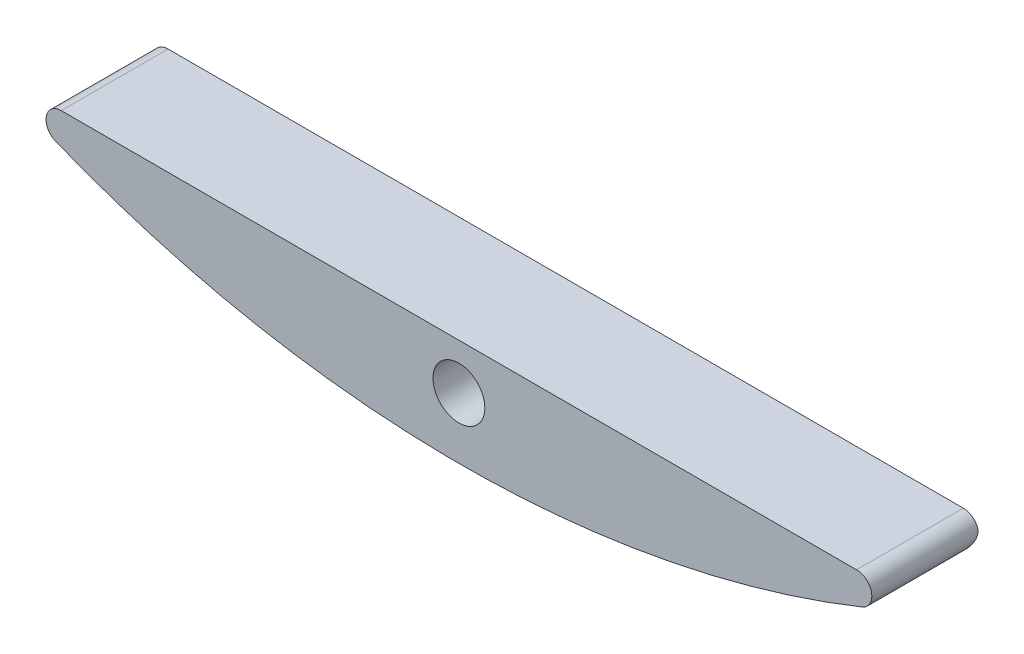
ISO-10303-21;
HEADER;
FILE_DESCRIPTION(('STEP AP214'),'2;1');
FILE_NAME('part.step','',(''),(''),'','','');
FILE_SCHEMA(('AUTOMOTIVE_DESIGN { 1 0 10303 214 1 1 1 1 }'));
ENDSEC;
DATA;
#1=APPLICATION_CONTEXT('core data for automotive mechanical design processes');
#2=APPLICATION_PROTOCOL_DEFINITION('international standard','automotive_design',2000,#1);
#3=PRODUCT_CONTEXT('',#1,'mechanical');
#4=PRODUCT('Part','Part','',(#3));
#5=PRODUCT_RELATED_PRODUCT_CATEGORY('part','',(#4));
#6=PRODUCT_DEFINITION_FORMATION('','',#4);
#7=PRODUCT_DEFINITION_CONTEXT('part definition',#1,'design');
#8=PRODUCT_DEFINITION('design','',#6,#7);
#9=PRODUCT_DEFINITION_SHAPE('','',#8);
#10=(LENGTH_UNIT() NAMED_UNIT(*) SI_UNIT(.MILLI.,.METRE.));
#11=(NAMED_UNIT(*) PLANE_ANGLE_UNIT() SI_UNIT($,.RADIAN.));
#12=(NAMED_UNIT(*) SI_UNIT($,.STERADIAN.) SOLID_ANGLE_UNIT());
#13=UNCERTAINTY_MEASURE_WITH_UNIT(LENGTH_MEASURE(1.E-05),#10,'distance_accuracy_value','');
#14=(GEOMETRIC_REPRESENTATION_CONTEXT(3) GLOBAL_UNCERTAINTY_ASSIGNED_CONTEXT((#13)) GLOBAL_UNIT_ASSIGNED_CONTEXT((#10,
#11,#12)) REPRESENTATION_CONTEXT('',''));
#15=CARTESIAN_POINT('',(0.,0.,0.));
#16=DIRECTION('',(0.,0.,1.));
#17=DIRECTION('',(1.,0.,0.));
#18=AXIS2_PLACEMENT_3D('',#15,#16,#17);
#19=CARTESIAN_POINT('',(-65.4,-39.4091480503921,2.25));
#20=CARTESIAN_POINT('',(-65.4,-47.1758168926533,2.25));
#21=CARTESIAN_POINT('',(-62.002230156418,-62.7091545771757,2.25));
#22=CARTESIAN_POINT('',(-47.4725158501259,-82.4825096861815,2.25));
#23=CARTESIAN_POINT('',(-25.7003697345645,-95.7103519433827,2.25));
#24=CARTESIAN_POINT('',(0.,-100.358546103897,2.25));
#25=CARTESIAN_POINT('',(25.7003697345645,-95.7103519433827,2.25));
#26=CARTESIAN_POINT('',(47.4725158501259,-82.4825096861814,2.25));
#27=CARTESIAN_POINT('',(62.002230156418,-62.7091545771757,2.25));
#28=CARTESIAN_POINT('',(67.098884921791,-39.4091480503921,2.25));
#29=CARTESIAN_POINT('',(62.002230156418,-16.1091415236085,2.25));
#30=CARTESIAN_POINT('',(47.4725158501259,3.66421358539728,2.25));
#31=CARTESIAN_POINT('',(25.7003697345645,16.8920558425985,2.25));
#32=CARTESIAN_POINT('',(0.,21.5402500031126,2.25));
#33=CARTESIAN_POINT('',(-25.7003697345644,16.8920558425985,2.25));
#34=CARTESIAN_POINT('',(-47.4725158501259,3.66421358539729,2.25));
#35=CARTESIAN_POINT('',(-62.002230156418,-16.1091415236084,2.25));
#36=CARTESIAN_POINT('',(-65.4,-31.6424792081308,2.25));
#37=CARTESIAN_POINT('',(-65.4,-39.4091480503921,2.25));
#38=B_SPLINE_CURVE_WITH_KNOTS('',3,(#19,#20,#21,#22,#23,#24,#25,#26,#27,#28,#29,#30,#31,#32,#33,
#34,#35,#36,#37),.UNSPECIFIED.,.T.,.F.,(4,1,1,1,1,1,1,1,1,1,1,1,1,1,1,1,4),(0.,
0.392699081698724,0.785398163397448,1.17809724509617,1.5707963267949,1.96349540849362,
2.35619449019234,2.74889357189107,3.14159265358979,3.53429173528852,3.92699081698724,
4.31968989868597,4.71238898038469,5.10508806208341,5.49778714378214,5.89048622548086,
6.28318530717959),.UNSPECIFIED.);
#39=DIRECTION('',(0.,0.,-1.));
#40=VECTOR('',#39,1.);
#41=SURFACE_OF_LINEAR_EXTRUSION('',#38,#40);
#42=CARTESIAN_POINT('',(30.794718129518,-91.8091480503918,-2.25));
#43=CARTESIAN_POINT('',(30.2011780925464,-92.0972566747419,-2.25));
#44=CARTESIAN_POINT('',(29.6034440823991,-92.3767206262725,-2.25));
#45=CARTESIAN_POINT('',(28.4001190225392,-92.9181741411607,-2.25));
#46=CARTESIAN_POINT('',(27.7945280388364,-93.1801638512135,-2.25));
#47=CARTESIAN_POINT('',(26.5762465787074,-93.6863903612771,-2.25));
#48=CARTESIAN_POINT('',(25.9635589509341,-93.9306340166567,-2.25));
#49=CARTESIAN_POINT('',(24.731367770029,-94.4012710823301,-2.25));
#50=CARTESIAN_POINT('',(24.1118642141463,-94.6276644854194,-2.25));
#51=CARTESIAN_POINT('',(22.8666725995772,-95.0625724447579,-2.25));
#52=CARTESIAN_POINT('',(22.2409851058195,-95.2710886176346,-2.25));
#53=CARTESIAN_POINT('',(20.9839649732248,-95.6702787336811,-2.25));
#54=CARTESIAN_POINT('',(20.3526323245649,-95.8609526457977,-2.25));
#55=CARTESIAN_POINT('',(18.4514323909557,-96.4060908893161,-2.25));
#56=CARTESIAN_POINT('',(17.1738017252775,-96.7338674402645,-2.25));
#57=CARTESIAN_POINT('',(14.6023120740567,-97.3180993229161,-2.25));
#58=CARTESIAN_POINT('',(13.3084516127075,-97.5745481187898,-2.25));
#59=CARTESIAN_POINT('',(10.7085426686302,-98.0158984217001,-2.25));
#60=CARTESIAN_POINT('',(9.40249394642821,-98.2007985199102,-2.25));
#61=CARTESIAN_POINT('',(6.78295838696138,-98.4985402968712,-2.25));
#62=CARTESIAN_POINT('',(5.46947614172936,-98.6114224084434,-2.25));
#63=CARTESIAN_POINT('',(2.83833320768969,-98.7647046431156,-2.25));
#64=CARTESIAN_POINT('',(1.52067270701526,-98.8051079845474,-2.25));
#65=CARTESIAN_POINT('',(-1.11491072442326,-98.8126089118688,-2.25));
#66=CARTESIAN_POINT('',(-2.43283366355025,-98.7797035776013,-2.25));
#67=CARTESIAN_POINT('',(-5.06371075228979,-98.6413787228765,-2.25));
#68=CARTESIAN_POINT('',(-6.37666821196563,-98.5360219022534,-2.25));
#69=CARTESIAN_POINT('',(-8.99481861325401,-98.2534944872503,-2.25));
#70=CARTESIAN_POINT('',(-10.3000116809926,-98.0763250626556,-2.25));
#71=CARTESIAN_POINT('',(-12.8984296712964,-97.6506456759797,-2.25));
#72=CARTESIAN_POINT('',(-14.1916568638577,-97.4021495437976,-2.25));
#73=CARTESIAN_POINT('',(-16.7998015054205,-96.8257665203377,-2.25));
#74=CARTESIAN_POINT('',(-18.1142596733684,-96.4957854363028,-2.25));
#75=CARTESIAN_POINT('',(-20.0697059225313,-95.9444845701751,-2.25));
#76=CARTESIAN_POINT('',(-20.7187623451428,-95.7513474170514,-2.25));
#77=CARTESIAN_POINT('',(-22.011000938753,-95.3462617114354,-2.25));
#78=CARTESIAN_POINT('',(-22.6541831242552,-95.1343132054023,-2.25));
#79=CARTESIAN_POINT('',(-23.9336452406336,-94.6917290591618,-2.25));
#80=CARTESIAN_POINT('',(-24.5699291212325,-94.4611048309583,-2.25));
#81=CARTESIAN_POINT('',(-25.8353653438626,-93.9810515411192,-2.25));
#82=CARTESIAN_POINT('',(-26.4645176905504,-93.7316224917636,-2.25));
#83=CARTESIAN_POINT('',(-27.7153783850951,-93.2140773527534,-2.25));
#84=CARTESIAN_POINT('',(-28.337083708085,-92.9459539524835,-2.25));
#85=CARTESIAN_POINT('',(-29.5722372385059,-92.3913035350787,-2.25));
#86=CARTESIAN_POINT('',(-30.1856853638164,-92.1047763350753,-2.25));
#87=CARTESIAN_POINT('',(-30.794718129518,-91.8091480503918,-2.25));
#88=B_SPLINE_CURVE_WITH_KNOTS('',3,(#42,#43,#44,#45,#46,#47,#48,#49,#50,#51,#52,#53,#54,#55,#56,
#57,#58,#59,#60,#61,#62,#63,#64,#65,#66,#67,#68,#69,#70,#71,#72,#73,#74,#75,#76,#77,#78,#79,#80,
#81,#82,#83,#84,#85,#86,#87),.UNSPECIFIED.,.F.,.F.,(4,2,2,2,2,2,2,2,2,2,2,2,2,2,2,2,2,2,2,2,2,2,
4),(0.,1.97923679842005,3.95845697917213,5.93690846905304,7.91536075747075,9.89363394650467,
11.8719105785249,15.8266828001588,19.7818172820107,23.7370296383019,27.6900194741143,
31.6428337778752,35.5958055397465,39.5453606804563,43.4948514878124,47.4435770249539,
51.5068670162509,53.53818141951,55.5694908060673,57.5995681720336,59.6296442123323,
61.6605186359909,63.6914132424508),.UNSPECIFIED.);
#89=CARTESIAN_POINT('',(26.442037599285,-93.7370459000639,-2.25));
#90=VERTEX_POINT('',#89);
#91=CARTESIAN_POINT('',(-26.4420375992841,-93.7370459000642,-2.25));
#92=VERTEX_POINT('',#91);
#93=EDGE_CURVE('E115',#90,#92,#88,.T.);
#94=ORIENTED_EDGE('',*,*,#93,.T.);
#95=DIRECTION('',(0.,0.,-1.));
#96=VECTOR('',#95,1.);
#97=CARTESIAN_POINT('',(-26.4420375992849,-93.7370459000639,-2.25));
#98=LINE('',#97,#96);
#99=CARTESIAN_POINT('',(-26.4420375992849,-93.7370459000639,-8.25));
#100=VERTEX_POINT('',#99);
#101=EDGE_CURVE('E93',#92,#100,#98,.T.);
#102=ORIENTED_EDGE('',*,*,#101,.T.);
#103=CARTESIAN_POINT('',(49.5934281930455,-78.12852498016,-8.25));
#104=CARTESIAN_POINT('',(49.5934281930455,-78.12852498016,-9.25));
#105=CARTESIAN_POINT('',(48.8667916776592,-77.4415028738874,-9.25));
#106=CARTESIAN_POINT('',(48.9621920352396,-78.7962369749329,-8.25));
#107=CARTESIAN_POINT('',(48.9621920352396,-78.7962369749329,-9.25));
#108=CARTESIAN_POINT('',(48.2457996169623,-78.0983705772055,-9.25));
#109=CARTESIAN_POINT('',(48.3158762661979,-79.4497212453159,-8.25));
#110=CARTESIAN_POINT('',(48.3158762661979,-79.4497212453159,-9.25));
#111=CARTESIAN_POINT('',(47.6100097427402,-78.7412167905527,-9.25));
#112=CARTESIAN_POINT('',(46.9948587209965,-80.7270702001155,-8.25));
#113=CARTESIAN_POINT('',(46.9948587209965,-80.7270702001155,-9.25));
#114=CARTESIAN_POINT('',(46.3104361232715,-79.9978347061235,-9.25));
#115=CARTESIAN_POINT('',(46.3201597380186,-81.350937786298,-8.25));
#116=CARTESIAN_POINT('',(46.3201597380186,-81.350937786298,-9.25));
#117=CARTESIAN_POINT('',(45.6466551326049,-80.6116092566997,-9.25));
#118=CARTESIAN_POINT('',(44.9443798175133,-82.5677064053719,-8.25));
#119=CARTESIAN_POINT('',(44.9443798175133,-82.5677064053719,-9.25));
#120=CARTESIAN_POINT('',(44.2929282541328,-81.8088723439637,-9.25));
#121=CARTESIAN_POINT('',(44.243312689071,-83.1606232692094,-8.25));
#122=CARTESIAN_POINT('',(44.243312689071,-83.1606232692094,-9.25));
#123=CARTESIAN_POINT('',(43.6029960603659,-82.3923763627219,-9.25));
#124=CARTESIAN_POINT('',(42.8164477685032,-84.3153808171791,-8.25));
#125=CARTESIAN_POINT('',(42.8164477685033,-84.3153808171791,-9.25));
#126=CARTESIAN_POINT('',(42.1985729604546,-83.528972035592,-9.25));
#127=CARTESIAN_POINT('',(42.0906493455727,-84.8772207076909,-8.25));
#128=CARTESIAN_POINT('',(42.0906493455727,-84.8772207076909,-9.25));
#129=CARTESIAN_POINT('',(41.484081427887,-84.0820629130338,-9.25));
#130=CARTESIAN_POINT('',(39.8798486542364,-86.5146337481324,-8.25));
#131=CARTESIAN_POINT('',(39.8798486542364,-86.5146337481324,-9.25));
#132=CARTESIAN_POINT('',(39.3074377897811,-85.6941770584981,-9.25));
#133=CARTESIAN_POINT('',(38.3601414254111,-87.5432453369878,-8.25));
#134=CARTESIAN_POINT('',(38.3601414254111,-87.5432453369878,-9.25));
#135=CARTESIAN_POINT('',(37.8108378850225,-86.7071687042801,-9.25));
#136=CARTESIAN_POINT('',(35.2415743535403,-89.4713572476564,-8.25));
#137=CARTESIAN_POINT('',(35.2415743535403,-89.4713572476564,-9.25));
#138=CARTESIAN_POINT('',(34.7391305296439,-88.6063085229095,-9.25));
#139=CARTESIAN_POINT('',(33.6427056132717,-90.3708430120878,-8.25));
#140=CARTESIAN_POINT('',(33.6427056132717,-90.3708430120878,-9.25));
#141=CARTESIAN_POINT('',(33.1640142541743,-89.4924423940391,-9.25));
#142=CARTESIAN_POINT('',(31.1957428053073,-91.6197376306132,-8.25));
#143=CARTESIAN_POINT('',(31.1957428053072,-91.6197376306131,-9.25));
#144=CARTESIAN_POINT('',(30.7531708098857,-90.7229034016597,-9.25));
#145=CARTESIAN_POINT('',(30.3726250516259,-92.0190470200993,-8.25));
#146=CARTESIAN_POINT('',(30.3726250516259,-92.0190470200993,-9.25));
#147=CARTESIAN_POINT('',(29.9421651948396,-91.1163378347765,-9.25));
#148=CARTESIAN_POINT('',(28.7109949917896,-92.7841946511349,-8.25));
#149=CARTESIAN_POINT('',(28.7109949917896,-92.7841946511349,-9.25));
#150=CARTESIAN_POINT('',(28.3049268299432,-91.8702528314385,-9.25));
#151=CARTESIAN_POINT('',(27.872482743161,-93.1500330177287,-8.25));
#152=CARTESIAN_POINT('',(27.872482743161,-93.1500330177287,-9.25));
#153=CARTESIAN_POINT('',(27.4786941369935,-92.2307335180958,-9.25));
#154=CARTESIAN_POINT('',(26.1813722584244,-93.8477429576111,-8.25));
#155=CARTESIAN_POINT('',(26.1813722584244,-93.8477429576111,-9.25));
#156=CARTESIAN_POINT('',(25.8123668582336,-92.9182197768113,-9.25));
#157=CARTESIAN_POINT('',(25.3287730863244,-94.1796122632314,-8.25));
#158=CARTESIAN_POINT('',(25.3287730863244,-94.1796122632313,-9.25));
#159=CARTESIAN_POINT('',(24.9722713513268,-93.2452231140267,-9.25));
#160=CARTESIAN_POINT('',(23.6111519939455,-94.80888715313,-8.25));
#161=CARTESIAN_POINT('',(23.6111519939455,-94.80888715313,-9.25));
#162=CARTESIAN_POINT('',(23.2796730224148,-93.8653299379689,-9.25));
#163=CARTESIAN_POINT('',(22.7461301378323,-95.1062929153474,-8.25));
#164=CARTESIAN_POINT('',(22.7461301378323,-95.1062929153474,-9.25));
#165=CARTESIAN_POINT('',(22.4271702644952,-94.1584335997234,-9.25));
#166=CARTESIAN_POINT('',(21.0069526683353,-95.6661983320282,-8.25));
#167=CARTESIAN_POINT('',(21.0069526683353,-95.6661983320282,-9.25));
#168=CARTESIAN_POINT('',(20.7129837404664,-94.7102934066247,-9.25));
#169=CARTESIAN_POINT('',(20.1328187230868,-95.9287664498203,-8.25));
#170=CARTESIAN_POINT('',(20.1328187230868,-95.9287664498203,-9.25));
#171=CARTESIAN_POINT('',(19.8513216869309,-94.9691169176836,-9.25));
#172=CARTESIAN_POINT('',(18.3752051350902,-96.4197137557571,-8.25));
#173=CARTESIAN_POINT('',(18.3752051350902,-96.4197137557571,-9.25));
#174=CARTESIAN_POINT('',(18.1186514905431,-95.4530970900416,-9.25));
#175=CARTESIAN_POINT('',(17.4917252193489,-96.648091942255,-8.25));
#176=CARTESIAN_POINT('',(17.4917252193489,-96.648091942255,-9.25));
#177=CARTESIAN_POINT('',(17.2476430746755,-95.6782527649893,-9.25));
#178=CARTESIAN_POINT('',(14.830018947878,-97.2817750670188,-8.25));
#179=CARTESIAN_POINT('',(14.830018947878,-97.2817750670188,-9.25));
#180=CARTESIAN_POINT('',(14.6233560212484,-96.3030265955828,-9.25));
#181=CARTESIAN_POINT('',(13.0393483992415,-97.6360064991428,-8.25));
#182=CARTESIAN_POINT('',(13.0393483992415,-97.6360064991428,-9.25));
#183=CARTESIAN_POINT('',(12.8576547422262,-96.6523241092479,-9.25));
#184=CARTESIAN_POINT('',(10.715859440594,-98.0045340790212,-8.25));
#185=CARTESIAN_POINT('',(10.715859440594,-98.0045340790212,-9.25));
#186=CARTESIAN_POINT('',(10.5664787858845,-97.0157270208898,-9.25));
#187=CARTESIAN_POINT('',(10.1922684785192,-98.0816637399502,-8.25));
#188=CARTESIAN_POINT('',(10.1922684785192,-98.0816637399502,-9.25));
#189=CARTESIAN_POINT('',(10.0501638767021,-97.0917848110452,-9.25));
#190=CARTESIAN_POINT('',(9.1434643021272,-98.2243657308272,-8.25));
#191=CARTESIAN_POINT('',(9.1434643021272,-98.2243657308271,-9.25));
#192=CARTESIAN_POINT('',(9.01593003769267,-97.2325042928294,-9.25));
#193=CARTESIAN_POINT('',(8.61825098915001,-98.2899373432326,-8.25));
#194=CARTESIAN_POINT('',(8.61825098915001,-98.2899373432326,-9.25));
#195=CARTESIAN_POINT('',(8.49801101030903,-97.2971652769259,-9.25));
#196=CARTESIAN_POINT('',(6.93299877533559,-98.4814860407133,-8.25));
#197=CARTESIAN_POINT('',(6.93299877533559,-98.4814860407133,-9.25));
#198=CARTESIAN_POINT('',(6.83616695168673,-97.486053314074,-9.25));
#199=CARTESIAN_POINT('',(5.77033656411985,-98.5850836330322,-8.25));
#200=CARTESIAN_POINT('',(5.77033656411986,-98.5850836330322,-9.25));
#201=CARTESIAN_POINT('',(5.68965862971359,-97.5882110436265,-9.25));
#202=CARTESIAN_POINT('',(3.44109089465123,-98.7355424983645,-8.25));
#203=CARTESIAN_POINT('',(3.44109089465123,-98.7355424983645,-9.25));
#204=CARTESIAN_POINT('',(3.39286364237394,-97.7365735477155,-9.25));
#205=CARTESIAN_POINT('',(2.27450676698801,-98.7823935351213,-8.25));
#206=CARTESIAN_POINT('',(2.27450676698801,-98.7823935351213,-9.25));
#207=CARTESIAN_POINT('',(2.24257633284553,-97.7827682273287,-9.25));
#208=CARTESIAN_POINT('',(-0.0607148019794941,-98.8186755609444,-8.25));
#209=CARTESIAN_POINT('',(-0.0607148019794941,-98.8186755609444,-9.25));
#210=CARTESIAN_POINT('',(-0.0598929538702804,-97.8185428203457,-9.25));
#211=CARTESIAN_POINT('',(-1.22935314648314,-98.808056924214,-8.25));
#212=CARTESIAN_POINT('',(-1.22935314648314,-98.808056924214,-9.25));
#213=CARTESIAN_POINT('',(-1.21207570939803,-97.8080738039242,-9.25));
#214=CARTESIAN_POINT('',(-3.56444228036679,-98.7295371058228,-8.25));
#215=CARTESIAN_POINT('',(-3.56444228036679,-98.7295371058229,-9.25));
#216=CARTESIAN_POINT('',(-3.5144700708827,-97.7306511746737,-9.25));
#217=CARTESIAN_POINT('',(-4.73089315995236,-98.6616383407335,-8.25));
#218=CARTESIAN_POINT('',(-4.73089315995236,-98.6616383407335,-9.25));
#219=CARTESIAN_POINT('',(-4.66468175794507,-97.6636999447531,-9.25));
#220=CARTESIAN_POINT('',(-7.06296830357641,-98.4688099016889,-8.25));
#221=CARTESIAN_POINT('',(-7.06296830357641,-98.4688099016889,-9.25));
#222=CARTESIAN_POINT('',(-6.96433023770114,-97.4735537141176,-9.25));
#223=CARTESIAN_POINT('',(-8.22857698863424,-98.3436917819019,-8.25));
#224=CARTESIAN_POINT('',(-8.22857698863424,-98.3436917819019,-9.25));
#225=CARTESIAN_POINT('',(-8.11375180170509,-97.3501728683776,-9.25));
#226=CARTESIAN_POINT('',(-10.5521770272087,-98.0367500767265,-8.25));
#227=CARTESIAN_POINT('',(-10.5521770272087,-98.0367500767265,-9.25));
#228=CARTESIAN_POINT('',(-10.4050728860131,-97.0474949166142,-9.25));
#229=CARTESIAN_POINT('',(-11.7101682018595,-97.8549251646315,-8.25));
#230=CARTESIAN_POINT('',(-11.7101682018595,-97.8549251646315,-9.25));
#231=CARTESIAN_POINT('',(-11.5469722296896,-96.8681965023489,-9.25));
#232=CARTESIAN_POINT('',(-15.1682255717635,-97.224779385209,-8.25));
#233=CARTESIAN_POINT('',(-15.1682255717635,-97.224779385209,-9.25));
#234=CARTESIAN_POINT('',(-14.9568348037486,-96.2468320013781,-9.25));
#235=CARTESIAN_POINT('',(-17.4539305638631,-96.6916589365541,-8.25));
#236=CARTESIAN_POINT('',(-17.4539305638631,-96.6916589365541,-9.25));
#237=CARTESIAN_POINT('',(-17.2104961062612,-95.7211698708692,-9.25));
#238=CARTESIAN_POINT('',(-20.6772463821598,-95.7680667982215,-8.25));
#239=CARTESIAN_POINT('',(-20.6772463821598,-95.7680667982215,-9.25));
#240=CARTESIAN_POINT('',(-20.3879944165423,-94.8107061847826,-9.25));
#241=CARTESIAN_POINT('',(-21.641713787857,-95.4691007704374,-8.25));
#242=CARTESIAN_POINT('',(-21.641713787857,-95.4691007704374,-9.25));
#243=CARTESIAN_POINT('',(-21.3386696576474,-94.5160120562991,-9.25));
#244=CARTESIAN_POINT('',(-23.5570184968587,-94.8292096447175,-8.25));
#245=CARTESIAN_POINT('',(-23.5570184968587,-94.8292096447175,-9.25));
#246=CARTESIAN_POINT('',(-23.2263255284217,-93.8853594326098,-9.25));
#247=CARTESIAN_POINT('',(-24.507856331122,-94.4882861862787,-8.25));
#248=CARTESIAN_POINT('',(-24.507856331122,-94.4882861862788,-9.25));
#249=CARTESIAN_POINT('',(-24.1633066915907,-93.5494025497573,-9.25));
#250=CARTESIAN_POINT('',(-26.393373844607,-93.7646285270523,-8.25));
#251=CARTESIAN_POINT('',(-26.393373844607,-93.7646285270524,-9.25));
#252=CARTESIAN_POINT('',(-26.0212732778114,-92.8363184185438,-9.25));
#253=CARTESIAN_POINT('',(-27.3280564593725,-93.3819020167514,-8.25));
#254=CARTESIAN_POINT('',(-27.3280564593725,-93.3819020167514,-9.25));
#255=CARTESIAN_POINT('',(-26.942261607045,-92.4591987428899,-9.25));
#256=CARTESIAN_POINT('',(-29.1794777551707,-92.5753903035714,-8.25));
#257=CARTESIAN_POINT('',(-29.1794777551707,-92.5753903035714,-9.25));
#258=CARTESIAN_POINT('',(-28.7665344882545,-91.6645130864599,-9.25));
#259=CARTESIAN_POINT('',(-30.0962160406537,-92.1516041968314,-8.25));
#260=CARTESIAN_POINT('',(-30.0962160406537,-92.1516041968314,-9.25));
#261=CARTESIAN_POINT('',(-29.669818649975,-91.2469462153039,-9.25));
#262=CARTESIAN_POINT('',(-32.8131558298346,-90.8212837789731,-8.25));
#263=CARTESIAN_POINT('',(-32.8131558298346,-90.8212837789731,-9.25));
#264=CARTESIAN_POINT('',(-32.3467602381234,-89.9362098740444,-9.25));
#265=CARTESIAN_POINT('',(-34.5845001766106,-89.8540923703706,-8.25));
#266=CARTESIAN_POINT('',(-34.5845001766106,-89.8540923703706,-9.25));
#267=CARTESIAN_POINT('',(-34.0918604203666,-88.9833342658081,-9.25));
#268=CARTESIAN_POINT('',(-37.1706897484566,-88.2859900761555,-8.25));
#269=CARTESIAN_POINT('',(-37.1706897484566,-88.2859900761555,-9.25));
#270=CARTESIAN_POINT('',(-36.639280348356,-87.4387401214059,-9.25));
#271=CARTESIAN_POINT('',(-38.0212740438454,-87.7434966147668,-8.25));
#272=CARTESIAN_POINT('',(-38.0212740438454,-87.7434966147668,-9.25));
#273=CARTESIAN_POINT('',(-37.4770358578565,-86.9044254588209,-9.25));
#274=CARTESIAN_POINT('',(-39.6968545167024,-86.6198087550523,-8.25));
#275=CARTESIAN_POINT('',(-39.6968545167024,-86.6198087550523,-9.25));
#276=CARTESIAN_POINT('',(-39.1271561314327,-85.7978123882546,-9.25));
#277=CARTESIAN_POINT('',(-40.5218488039839,-86.038611507831,-8.25));
#278=CARTESIAN_POINT('',(-40.5218488039839,-86.0386115078311,-9.25));
#279=CARTESIAN_POINT('',(-39.9395190199354,-85.2255111841828,-9.25));
#280=CARTESIAN_POINT('',(-41.333129610401,-85.4382659631629,-8.25));
#281=CARTESIAN_POINT('',(-41.333129610401,-85.4382659631629,-9.25));
#282=CARTESIAN_POINT('',(-40.7382654342061,-84.6344397307718,-9.25));
#283=(BOUNDED_SURFACE() B_SPLINE_SURFACE(3,2,((#103,#104,#105),(#106,#107,#108),(#109,#110,
#111),(#112,#113,#114),(#115,#116,#117),(#118,#119,#120),(#121,#122,#123),(#124,#125,#126),
(#127,#128,#129),(#130,#131,#132),(#133,#134,#135),(#136,#137,#138),(#139,#140,#141),(#142,#143,
#144),(#145,#146,#147),(#148,#149,#150),(#151,#152,#153),(#154,#155,#156),(#157,#158,#159),
(#160,#161,#162),(#163,#164,#165),(#166,#167,#168),(#169,#170,#171),(#172,#173,#174),(#175,#176,
#177),(#178,#179,#180),(#181,#182,#183),(#184,#185,#186),(#187,#188,#189),(#190,#191,#192),
(#193,#194,#195),(#196,#197,#198),(#199,#200,#201),(#202,#203,#204),(#205,#206,#207),(#208,#209,
#210),(#211,#212,#213),(#214,#215,#216),(#217,#218,#219),(#220,#221,#222),(#223,#224,#225),
(#226,#227,#228),(#229,#230,#231),(#232,#233,#234),(#235,#236,#237),(#238,#239,#240),(#241,#242,
#243),(#244,#245,#246),(#247,#248,#249),(#250,#251,#252),(#253,#254,#255),(#256,#257,#258),
(#259,#260,#261),(#262,#263,#264),(#265,#266,#267),(#268,#269,#270),(#271,#272,#273),(#274,#275,
#276),(#277,#278,#279),(#280,#281,#282)),.UNSPECIFIED.,.F.,.F.,
.F.) B_SPLINE_SURFACE_WITH_KNOTS((4,2,2,2,2,2,2,2,2,2,2,2,2,2,2,2,2,2,2,2,2,2,2,2,2,2,2,2,2,4),
(3,3),(0.,2.71155253751283,5.42283885351271,8.13272450831321,10.8426793342256,16.2574926823426,
21.6729160068637,24.3765056424236,27.0800851772331,29.783845077006,32.4875910163511,
35.1859422347496,37.884372490048,43.2775845645025,44.8431888637541,46.4088903240608,
49.8605636326947,53.3128594805109,56.76813690524,60.2232685637617,63.6898621985124,
67.1565369434347,74.0852884801368,77.0705473810624,80.0556896692685,83.0402837043869,
86.0249434554793,91.9803203451456,94.9603905123252,97.940680278506),(0.,1.),
.UNSPECIFIED.) GEOMETRIC_REPRESENTATION_ITEM() RATIONAL_B_SPLINE_SURFACE(((1.,0.707106781186548,
1.),(1.,0.707106781186548,1.),(1.,0.707106781186548,1.),(1.,0.707106781186548,1.),(1.,
0.707106781186548,1.),(1.,0.707106781186548,1.),(1.,0.707106781186548,1.),(1.,0.707106781186548,
1.),(1.,0.707106781186548,1.),(1.,0.707106781186548,1.),(1.,0.707106781186548,1.),(1.,
0.707106781186548,1.),(1.,0.707106781186548,1.),(1.,0.707106781186548,1.),(1.,0.707106781186548,
1.),(1.,0.707106781186548,1.),(1.,0.707106781186548,1.),(1.,0.707106781186548,1.),(1.,
0.707106781186548,1.),(1.,0.707106781186548,1.),(1.,0.707106781186548,1.),(1.,0.707106781186548,
1.),(1.,0.707106781186548,1.),(1.,0.707106781186548,1.),(1.,0.707106781186548,1.),(1.,
0.707106781186548,1.),(1.,0.707106781186548,1.),(1.,0.707106781186548,1.),(1.,0.707106781186548,
1.),(1.,0.707106781186548,1.),(1.,0.707106781186548,1.),(1.,0.707106781186548,1.),(1.,
0.707106781186548,1.),(1.,0.707106781186548,1.),(1.,0.707106781186548,1.),(1.,0.707106781186548,
1.),(1.,0.707106781186548,1.),(1.,0.707106781186548,1.),(1.,0.707106781186548,1.),(1.,
0.707106781186548,1.),(1.,0.707106781186548,1.),(1.,0.707106781186548,1.),(1.,0.707106781186548,
1.),(1.,0.707106781186548,1.),(1.,0.707106781186548,1.),(1.,0.707106781186548,1.),(1.,
0.707106781186548,1.),(1.,0.707106781186548,1.),(1.,0.707106781186548,1.),(1.,0.707106781186548,
1.),(1.,0.707106781186548,1.),(1.,0.707106781186548,1.),(1.,0.707106781186548,1.),(1.,
0.707106781186548,1.),(1.,0.707106781186548,1.),(1.,0.707106781186548,1.),(1.,0.707106781186548,
1.),(1.,0.707106781186548,1.),(1.,0.707106781186548,1.),(1.,0.707106781186548,1.))) REPRESENTATION_ITEM('') SURFACE());
#284=CARTESIAN_POINT('',(-41.333129610401,-85.4382659631629,-8.25));
#285=CARTESIAN_POINT('',(-40.5218488039839,-86.038611507831,-8.25));
#286=CARTESIAN_POINT('',(-39.6968545167024,-86.6198087550523,-8.25));
#287=CARTESIAN_POINT('',(-38.0212740438454,-87.7434966147668,-8.25));
#288=CARTESIAN_POINT('',(-37.1706897484566,-88.2859900761555,-8.25));
#289=CARTESIAN_POINT('',(-34.5845001766106,-89.8540923703706,-8.25));
#290=CARTESIAN_POINT('',(-32.8131558298346,-90.8212837789731,-8.25));
#291=CARTESIAN_POINT('',(-30.0962160406537,-92.1516041968314,-8.25));
#292=CARTESIAN_POINT('',(-29.1794777551707,-92.5753903035714,-8.25));
#293=CARTESIAN_POINT('',(-27.3280564593725,-93.3819020167514,-8.25));
#294=CARTESIAN_POINT('',(-26.393373844607,-93.7646285270523,-8.25));
#295=CARTESIAN_POINT('',(-24.507856331122,-94.4882861862787,-8.25));
#296=CARTESIAN_POINT('',(-23.5570184968587,-94.8292096447175,-8.25));
#297=CARTESIAN_POINT('',(-21.641713787857,-95.4691007704374,-8.25));
#298=CARTESIAN_POINT('',(-20.6772463821598,-95.7680667982215,-8.25));
#299=CARTESIAN_POINT('',(-17.4539305638631,-96.6916589365541,-8.25));
#300=CARTESIAN_POINT('',(-15.1682255717635,-97.224779385209,-8.25));
#301=CARTESIAN_POINT('',(-11.7101682018595,-97.8549251646315,-8.25));
#302=CARTESIAN_POINT('',(-10.5521770272087,-98.0367500767265,-8.25));
#303=CARTESIAN_POINT('',(-8.22857698863424,-98.3436917819019,-8.25));
#304=CARTESIAN_POINT('',(-7.06296830357641,-98.4688099016889,-8.25));
#305=CARTESIAN_POINT('',(-4.73089315995236,-98.6616383407335,-8.25));
#306=CARTESIAN_POINT('',(-3.56444228036679,-98.7295371058228,-8.25));
#307=CARTESIAN_POINT('',(-1.22935314648314,-98.808056924214,-8.25));
#308=CARTESIAN_POINT('',(-0.0607148019794951,-98.8186755609444,-8.25));
#309=CARTESIAN_POINT('',(2.27450676698801,-98.7823935351213,-8.25));
#310=CARTESIAN_POINT('',(3.44109089465123,-98.7355424983645,-8.25));
#311=CARTESIAN_POINT('',(5.77033656411985,-98.5850836330322,-8.25));
#312=CARTESIAN_POINT('',(6.93299877533559,-98.4814860407133,-8.25));
#313=CARTESIAN_POINT('',(8.61825098915001,-98.2899373432326,-8.25));
#314=CARTESIAN_POINT('',(9.1434643021272,-98.2243657308272,-8.25));
#315=CARTESIAN_POINT('',(10.1922684785192,-98.0816637399502,-8.25));
#316=CARTESIAN_POINT('',(10.715859440594,-98.0045340790212,-8.25));
#317=CARTESIAN_POINT('',(13.0393483992415,-97.6360064991428,-8.25));
#318=CARTESIAN_POINT('',(14.830018947878,-97.2817750670188,-8.25));
#319=CARTESIAN_POINT('',(17.4917252193489,-96.648091942255,-8.25));
#320=CARTESIAN_POINT('',(18.3752051350902,-96.4197137557571,-8.25));
#321=CARTESIAN_POINT('',(20.1328187230868,-95.9287664498203,-8.25));
#322=CARTESIAN_POINT('',(21.0069526683353,-95.6661983320282,-8.25));
#323=CARTESIAN_POINT('',(22.7461301378323,-95.1062929153474,-8.25));
#324=CARTESIAN_POINT('',(23.6111519939455,-94.80888715313,-8.25));
#325=CARTESIAN_POINT('',(25.3287730863244,-94.1796122632314,-8.25));
#326=CARTESIAN_POINT('',(26.1813722584244,-93.8477429576111,-8.25));
#327=CARTESIAN_POINT('',(27.872482743161,-93.1500330177287,-8.25));
#328=CARTESIAN_POINT('',(28.7109949917896,-92.7841946511349,-8.25));
#329=CARTESIAN_POINT('',(30.3726250516259,-92.0190470200993,-8.25));
#330=CARTESIAN_POINT('',(31.1957428053073,-91.6197376306131,-8.25));
#331=CARTESIAN_POINT('',(33.6427056132717,-90.3708430120878,-8.25));
#332=CARTESIAN_POINT('',(35.2415743535403,-89.4713572476564,-8.25));
#333=CARTESIAN_POINT('',(38.3601414254111,-87.5432453369878,-8.25));
#334=CARTESIAN_POINT('',(39.8798486542364,-86.5146337481324,-8.25));
#335=CARTESIAN_POINT('',(42.0906493455727,-84.8772207076909,-8.25));
#336=CARTESIAN_POINT('',(42.8164477685032,-84.3153808171791,-8.25));
#337=CARTESIAN_POINT('',(44.243312689071,-83.1606232692094,-8.25));
#338=CARTESIAN_POINT('',(44.9443798175133,-82.5677064053719,-8.25));
#339=CARTESIAN_POINT('',(46.3201597380186,-81.350937786298,-8.25));
#340=CARTESIAN_POINT('',(46.9948587209965,-80.7270702001155,-8.25));
#341=CARTESIAN_POINT('',(48.3158762661979,-79.4497212453159,-8.25));
#342=CARTESIAN_POINT('',(48.9621920352396,-78.7962369749329,-8.25));
#343=CARTESIAN_POINT('',(49.5934281930455,-78.12852498016,-8.25));
#344=B_SPLINE_CURVE_WITH_KNOTS('',3,(#284,#285,#286,#287,#288,#289,#290,#291,#292,#293,#294,
#295,#296,#297,#298,#299,#300,#301,#302,#303,#304,#305,#306,#307,#308,#309,#310,#311,#312,#313,
#314,#315,#316,#317,#318,#319,#320,#321,#322,#323,#324,#325,#326,#327,#328,#329,#330,#331,#332,
#333,#334,#335,#336,#337,#338,#339,#340,#341,#342,#343),.UNSPECIFIED.,.F.,.F.,(4,2,2,2,2,2,2,2,
2,2,2,2,2,2,2,2,2,2,2,2,2,2,2,2,2,2,2,2,2,4),(0.,2.9802897661808,5.96035993336047,
11.9157368230267,14.9003965741191,17.8849906092376,20.8701328974436,23.8553917983693,
30.7841433350713,34.2508180799936,37.7174117147444,41.172543373266,44.6278207979951,
48.0801166458113,51.5317899544452,53.097491414752,54.6630957140035,60.056307788458,
62.7547380437564,65.4530892621549,68.1568352015001,70.8605951012729,73.5641746360824,
76.2677642716424,81.6831875961634,87.0980009442804,89.8079557701928,92.5178414249933,
95.2291277409932,97.940680278506),.UNSPECIFIED.);
#345=CARTESIAN_POINT('',(26.442037599285,-93.7370459000639,-8.25));
#346=VERTEX_POINT('',#345);
#347=EDGE_CURVE('E99',#100,#346,#344,.T.);
#348=ORIENTED_EDGE('',*,*,#347,.T.);
#349=DIRECTION('',(0.,0.,-1.));
#350=VECTOR('',#349,1.);
#351=CARTESIAN_POINT('',(26.442037599285,-93.7370459000639,-8.25));
#352=LINE('',#351,#350);
#353=EDGE_CURVE('E261',#346,#90,#352,.F.);
#354=ORIENTED_EDGE('',*,*,#353,.T.);
#355=EDGE_LOOP('',(#94,#102,#348,#354));
#356=FACE_BOUND('',#355,.T.);
#357=ADVANCED_FACE('F38',(#356),#41,.F.);
#358=CARTESIAN_POINT('',(30.794718129518,-91.8091480503918,-9.25));
#359=DIRECTION('',(0.,-1.,0.));
#360=DIRECTION('',(1.,0.,0.));
#361=AXIS2_PLACEMENT_3D('',#358,#359,#360);
#362=PLANE('',#361);
#363=DIRECTION('',(1.,0.,0.));
#364=VECTOR('',#363,1.);
#365=CARTESIAN_POINT('',(30.794718129518,-91.8091480503918,-9.25));
#366=LINE('',#365,#364);
#367=CARTESIAN_POINT('',(-26.0692030775814,-91.8091480503918,-9.25));
#368=VERTEX_POINT('',#367);
#369=CARTESIAN_POINT('',(26.0692030775814,-91.8091480503918,-9.25));
#370=VERTEX_POINT('',#369);
#371=EDGE_CURVE('E108',#368,#370,#366,.T.);
#372=ORIENTED_EDGE('',*,*,#371,.F.);
#373=DIRECTION('',(0.,0.,-1.));
#374=VECTOR('',#373,1.);
#375=CARTESIAN_POINT('',(-26.0692030775814,-91.8091480503918,-9.25));
#376=LINE('',#375,#374);
#377=CARTESIAN_POINT('',(-26.0692030775814,-91.8091480503918,-2.25));
#378=VERTEX_POINT('',#377);
#379=EDGE_CURVE('E92',#368,#378,#376,.F.);
#380=ORIENTED_EDGE('',*,*,#379,.T.);
#381=DIRECTION('',(1.,0.,0.));
#382=VECTOR('',#381,1.);
#383=CARTESIAN_POINT('',(30.794718129518,-91.8091480503918,-2.25));
#384=LINE('',#383,#382);
#385=CARTESIAN_POINT('',(26.0692030775814,-91.8091480503918,-2.25));
#386=VERTEX_POINT('',#385);
#387=EDGE_CURVE('E106',#378,#386,#384,.T.);
#388=ORIENTED_EDGE('',*,*,#387,.T.);
#389=DIRECTION('',(0.,0.,-1.));
#390=VECTOR('',#389,1.);
#391=CARTESIAN_POINT('',(26.0692030775814,-91.8091480503918,-9.25));
#392=LINE('',#391,#390);
#393=EDGE_CURVE('E110',#386,#370,#392,.T.);
#394=ORIENTED_EDGE('',*,*,#393,.T.);
#395=EDGE_LOOP('',(#372,#380,#388,#394));
#396=FACE_BOUND('',#395,.T.);
#397=ADVANCED_FACE('F105',(#396),#362,.F.);
#398=CARTESIAN_POINT('',(65.4,-39.4091480503921,-9.25));
#399=DIRECTION('',(0.,0.,1.));
#400=DIRECTION('',(1.,0.,0.));
#401=AXIS2_PLACEMENT_3D('',#398,#399,#400);
#402=PLANE('',#401);
#403=CARTESIAN_POINT('',(0.,-94.8091481004845,-9.25));
#404=DIRECTION('',(0.,0.,1.));
#405=DIRECTION('',(1.,0.,0.));
#406=AXIS2_PLACEMENT_3D('',#403,#404,#405);
#407=CIRCLE('',#406,1.7);
#408=CARTESIAN_POINT('',(1.7,-94.8091481004845,-9.25));
#409=VERTEX_POINT('',#408);
#410=EDGE_CURVE('E175',#409,#409,#407,.T.);
#411=ORIENTED_EDGE('',*,*,#410,.T.);
#412=EDGE_LOOP('',(#411));
#413=FACE_BOUND('',#412,.T.);
#414=CARTESIAN_POINT('',(48.8667916776592,-77.4415028738874,-9.25));
#415=CARTESIAN_POINT('',(48.2457996169623,-78.0983705772055,-9.25));
#416=CARTESIAN_POINT('',(47.6100097427402,-78.7412167905527,-9.25));
#417=CARTESIAN_POINT('',(46.3104361232715,-79.9978347061234,-9.25));
#418=CARTESIAN_POINT('',(45.6466551326049,-80.6116092566996,-9.25));
#419=CARTESIAN_POINT('',(44.2929282541328,-81.8088723439637,-9.25));
#420=CARTESIAN_POINT('',(43.6029960603659,-82.3923763627219,-9.25));
#421=CARTESIAN_POINT('',(42.1985729604546,-83.528972035592,-9.25));
#422=CARTESIAN_POINT('',(41.484081427887,-84.0820629130338,-9.25));
#423=CARTESIAN_POINT('',(39.3074377897811,-85.6941770584981,-9.25));
#424=CARTESIAN_POINT('',(37.8108378850225,-86.7071687042801,-9.25));
#425=CARTESIAN_POINT('',(34.7391305296439,-88.6063085229095,-9.25));
#426=CARTESIAN_POINT('',(33.1640142541743,-89.4924423940391,-9.25));
#427=CARTESIAN_POINT('',(30.7531708098857,-90.7229034016597,-9.25));
#428=CARTESIAN_POINT('',(29.9421651948396,-91.1163378347765,-9.25));
#429=CARTESIAN_POINT('',(28.3049268299432,-91.8702528314385,-9.25));
#430=CARTESIAN_POINT('',(27.4786941369935,-92.2307335180958,-9.25));
#431=CARTESIAN_POINT('',(25.8123668582336,-92.9182197768113,-9.25));
#432=CARTESIAN_POINT('',(24.9722713513268,-93.2452231140267,-9.25));
#433=CARTESIAN_POINT('',(23.2796730224148,-93.8653299379689,-9.25));
#434=CARTESIAN_POINT('',(22.4271702644952,-94.1584335997234,-9.25));
#435=CARTESIAN_POINT('',(20.7129837404664,-94.7102934066247,-9.25));
#436=CARTESIAN_POINT('',(19.8513216869309,-94.9691169176836,-9.25));
#437=CARTESIAN_POINT('',(18.1186514905431,-95.4530970900416,-9.25));
#438=CARTESIAN_POINT('',(17.2476430746755,-95.6782527649893,-9.25));
#439=CARTESIAN_POINT('',(14.6233560212484,-96.3030265955828,-9.25));
#440=CARTESIAN_POINT('',(12.8576547422262,-96.6523241092479,-9.25));
#441=CARTESIAN_POINT('',(10.5664787858845,-97.0157270208898,-9.25));
#442=CARTESIAN_POINT('',(10.0501638767021,-97.0917848110452,-9.25));
#443=CARTESIAN_POINT('',(9.01593003769267,-97.2325042928294,-9.25));
#444=CARTESIAN_POINT('',(8.49801101030903,-97.2971652769259,-9.25));
#445=CARTESIAN_POINT('',(6.83616695168673,-97.486053314074,-9.25));
#446=CARTESIAN_POINT('',(5.68965862971359,-97.5882110436265,-9.25));
#447=CARTESIAN_POINT('',(3.39286364237394,-97.7365735477155,-9.25));
#448=CARTESIAN_POINT('',(2.24257633284553,-97.7827682273287,-9.25));
#449=CARTESIAN_POINT('',(-0.0598929538702809,-97.8185428203457,-9.25));
#450=CARTESIAN_POINT('',(-1.21207570939803,-97.8080738039242,-9.25));
#451=CARTESIAN_POINT('',(-3.5144700708827,-97.7306511746737,-9.25));
#452=CARTESIAN_POINT('',(-4.66468175794507,-97.6636999447531,-9.25));
#453=CARTESIAN_POINT('',(-6.96433023770114,-97.4735537141176,-9.25));
#454=CARTESIAN_POINT('',(-8.11375180170509,-97.3501728683776,-9.25));
#455=CARTESIAN_POINT('',(-10.4050728860131,-97.0474949166142,-9.25));
#456=CARTESIAN_POINT('',(-11.5469722296896,-96.8681965023489,-9.25));
#457=CARTESIAN_POINT('',(-14.9568348037486,-96.2468320013781,-9.25));
#458=CARTESIAN_POINT('',(-17.2104961062612,-95.7211698708692,-9.25));
#459=CARTESIAN_POINT('',(-20.3879944165423,-94.8107061847826,-9.25));
#460=CARTESIAN_POINT('',(-21.3386696576474,-94.5160120562991,-9.25));
#461=CARTESIAN_POINT('',(-23.2263255284217,-93.8853594326098,-9.25));
#462=CARTESIAN_POINT('',(-24.1633066915907,-93.5494025497573,-9.25));
#463=CARTESIAN_POINT('',(-26.0212732778114,-92.8363184185438,-9.25));
#464=CARTESIAN_POINT('',(-26.942261607045,-92.4591987428899,-9.25));
#465=CARTESIAN_POINT('',(-28.7665344882545,-91.6645130864599,-9.25));
#466=CARTESIAN_POINT('',(-29.669818649975,-91.2469462153039,-9.25));
#467=CARTESIAN_POINT('',(-32.3467602381234,-89.9362098740444,-9.25));
#468=CARTESIAN_POINT('',(-34.0918604203666,-88.9833342658081,-9.25));
#469=CARTESIAN_POINT('',(-36.639280348356,-87.4387401214059,-9.25));
#470=CARTESIAN_POINT('',(-37.4770358578565,-86.9044254588209,-9.25));
#471=CARTESIAN_POINT('',(-39.1271561314327,-85.7978123882547,-9.25));
#472=CARTESIAN_POINT('',(-39.9395190199354,-85.2255111841828,-9.25));
#473=CARTESIAN_POINT('',(-40.7382654342061,-84.6344397307718,-9.25));
#474=B_SPLINE_CURVE_WITH_KNOTS('',3,(#414,#415,#416,#417,#418,#419,#420,#421,#422,#423,#424,
#425,#426,#427,#428,#429,#430,#431,#432,#433,#434,#435,#436,#437,#438,#439,#440,#441,#442,#443,
#444,#445,#446,#447,#448,#449,#450,#451,#452,#453,#454,#455,#456,#457,#458,#459,#460,#461,#462,
#463,#464,#465,#466,#467,#468,#469,#470,#471,#472,#473),.UNSPECIFIED.,.F.,.F.,(4,2,2,2,2,2,2,2,
2,2,2,2,2,2,2,2,2,2,2,2,2,2,2,2,2,2,2,2,2,4),(0.,2.71155253751283,5.42283885351271,
8.13272450831321,10.8426793342256,16.2574926823426,21.6729160068637,24.3765056424236,
27.0800851772331,29.783845077006,32.4875910163511,35.1859422347496,37.884372490048,
43.2775845645025,44.8431888637541,46.4088903240608,49.8605636326947,53.3128594805109,
56.76813690524,60.2232685637617,63.6898621985124,67.1565369434347,74.0852884801368,
77.0705473810624,80.0556896692685,83.0402837043869,86.0249434554793,91.9803203451456,
94.9603905123252,97.940680278506),.UNSPECIFIED.);
#475=CARTESIAN_POINT('',(26.9943056879895,-92.4294308395414,-9.25));
#476=VERTEX_POINT('',#475);
#477=CARTESIAN_POINT('',(-26.9943056879895,-92.4294308395414,-9.25));
#478=VERTEX_POINT('',#477);
#479=EDGE_CURVE('E56',#476,#478,#474,.T.);
#480=ORIENTED_EDGE('',*,*,#479,.T.);
#481=CARTESIAN_POINT('',(-26.0692030775814,-92.8091480503919,-9.25));
#482=DIRECTION('',(0.,0.,1.));
#483=DIRECTION('',(1.,0.,0.));
#484=AXIS2_PLACEMENT_3D('',#481,#482,#483);
#485=CIRCLE('',#484,1.);
#486=EDGE_CURVE('E11',#478,#368,#485,.F.);
#487=ORIENTED_EDGE('',*,*,#486,.T.);
#488=ORIENTED_EDGE('',*,*,#371,.T.);
#489=CARTESIAN_POINT('',(26.0692030775814,-92.8091480503918,-9.25));
#490=DIRECTION('',(0.,0.,1.));
#491=DIRECTION('',(1.,0.,0.));
#492=AXIS2_PLACEMENT_3D('',#489,#490,#491);
#493=CIRCLE('',#492,1.);
#494=EDGE_CURVE('E49',#370,#476,#493,.F.);
#495=ORIENTED_EDGE('',*,*,#494,.T.);
#496=EDGE_LOOP('',(#480,#487,#488,#495));
#497=FACE_BOUND('',#496,.T.);
#498=ADVANCED_FACE('F188',(#413,#497),#402,.F.);
#499=CARTESIAN_POINT('',(65.4,-39.4091480503921,-2.25));
#500=DIRECTION('',(0.,0.,1.));
#501=DIRECTION('',(1.,0.,0.));
#502=AXIS2_PLACEMENT_3D('',#499,#500,#501);
#503=PLANE('',#502);
#504=CARTESIAN_POINT('',(0.,-94.8091481004845,-2.25));
#505=DIRECTION('',(0.,0.,1.));
#506=DIRECTION('',(1.,0.,0.));
#507=AXIS2_PLACEMENT_3D('',#504,#505,#506);
#508=CIRCLE('',#507,1.7);
#509=CARTESIAN_POINT('',(1.7,-94.8091481004845,-2.25));
#510=VERTEX_POINT('',#509);
#511=EDGE_CURVE('E43',#510,#510,#508,.T.);
#512=ORIENTED_EDGE('',*,*,#511,.F.);
#513=EDGE_LOOP('',(#512));
#514=FACE_BOUND('',#513,.T.);
#515=ORIENTED_EDGE('',*,*,#387,.F.);
#516=CARTESIAN_POINT('',(-26.0692030775814,-92.8091480503919,-2.25));
#517=DIRECTION('',(0.,0.,1.));
#518=DIRECTION('',(1.,0.,0.));
#519=AXIS2_PLACEMENT_3D('',#516,#517,#518);
#520=CIRCLE('',#519,1.);
#521=EDGE_CURVE('E87',#378,#92,#520,.T.);
#522=ORIENTED_EDGE('',*,*,#521,.T.);
#523=ORIENTED_EDGE('',*,*,#93,.F.);
#524=CARTESIAN_POINT('',(26.0692030775814,-92.8091480503918,-2.25));
#525=DIRECTION('',(0.,0.,1.));
#526=DIRECTION('',(1.,0.,0.));
#527=AXIS2_PLACEMENT_3D('',#524,#525,#526);
#528=CIRCLE('',#527,1.);
#529=EDGE_CURVE('E100',#90,#386,#528,.T.);
#530=ORIENTED_EDGE('',*,*,#529,.T.);
#531=EDGE_LOOP('',(#515,#522,#523,#530));
#532=FACE_BOUND('',#531,.T.);
#533=ADVANCED_FACE('F112',(#514,#532),#503,.T.);
#534=CARTESIAN_POINT('',(26.0692030775814,-92.8091480503918,-5.75));
#535=DIRECTION('',(0.,0.,-1.));
#536=DIRECTION('',(-1.,0.,0.));
#537=AXIS2_PLACEMENT_3D('',#534,#535,#536);
#538=CYLINDRICAL_SURFACE('',#537,1.);
#539=ORIENTED_EDGE('',*,*,#529,.F.);
#540=ORIENTED_EDGE('',*,*,#353,.F.);
#541=CARTESIAN_POINT('',(26.9943056879896,-92.4294308395414,-9.25));
#542=CARTESIAN_POINT('',(27.0028408011606,-92.4502168558153,-9.25000302899913));
#543=CARTESIAN_POINT('',(27.0106637096407,-92.4712800545083,-9.24924209296932));
#544=CARTESIAN_POINT('',(27.024845689212,-92.5137710032795,-9.24622990480653));
#545=CARTESIAN_POINT('',(27.031205922911,-92.5351984491842,-9.24397984186241));
#546=CARTESIAN_POINT('',(27.0479465848864,-92.5993880738871,-9.23510647062425));
#547=CARTESIAN_POINT('',(27.0561485229048,-92.6424551125769,-9.22635838867647));
#548=CARTESIAN_POINT('',(27.0668165635743,-92.7277969887417,-9.20388823059556));
#549=CARTESIAN_POINT('',(27.0692986751243,-92.7700737079799,-9.19018016158655));
#550=CARTESIAN_POINT('',(27.0691015440509,-92.8530973632909,-9.15860618139065));
#551=CARTESIAN_POINT('',(27.0664104866565,-92.893840580369,-9.14073083468104));
#552=CARTESIAN_POINT('',(27.0544531410159,-92.9892720404598,-9.09368531679823));
#553=CARTESIAN_POINT('',(27.0429534140723,-93.0428732619189,-9.06288149015107));
#554=CARTESIAN_POINT('',(27.0126766937203,-93.1448544442469,-8.99659420187249));
#555=CARTESIAN_POINT('',(26.9938860366296,-93.1932243824063,-8.96110203684866));
#556=CARTESIAN_POINT('',(26.9422092495525,-93.3018171502407,-8.8727411941313));
#557=CARTESIAN_POINT('',(26.906680135226,-93.359570053238,-8.81839043142454));
#558=CARTESIAN_POINT('',(26.82724399531,-93.4646789508613,-8.70595650418029));
#559=CARTESIAN_POINT('',(26.7833268450749,-93.5120222306151,-8.64786888590636));
#560=CARTESIAN_POINT('',(26.6926396896661,-93.5932021773883,-8.53412938970497));
#561=CARTESIAN_POINT('',(26.6463445497131,-93.6277947787466,-8.47863085652549));
#562=CARTESIAN_POINT('',(26.5493491440324,-93.6881888941513,-8.36690415953877));
#563=CARTESIAN_POINT('',(26.4986582906867,-93.7140086369478,-8.31067776380358));
#564=CARTESIAN_POINT('',(26.4448334704082,-93.7359188280616,-8.25299236504316));
#565=CARTESIAN_POINT('',(26.4434361462072,-93.7364839528664,-8.25149616499383));
#566=CARTESIAN_POINT('',(26.442037599285,-93.7370459000639,-8.25));
#567=B_SPLINE_CURVE_WITH_KNOTS('',3,(#541,#542,#543,#544,#545,#546,#547,#548,#549,#550,#551,
#552,#553,#554,#555,#556,#557,#558,#559,#560,#561,#562,#563,#564,#565,#566),.UNSPECIFIED.,.F.,
.F.,(4,2,2,2,2,2,2,2,2,2,2,2,4),(0.,0.0673581974132685,0.134662668634481,0.268004443944945,
0.400972560840568,0.534244718540799,0.721852626365056,0.909813835255019,1.16912029648381,
1.42874175039811,1.66851280591382,1.90778256018485,1.91415392531928),.UNSPECIFIED.);
#568=EDGE_CURVE('E120',#476,#346,#567,.T.);
#569=ORIENTED_EDGE('',*,*,#568,.F.);
#570=ORIENTED_EDGE('',*,*,#494,.F.);
#571=ORIENTED_EDGE('',*,*,#393,.F.);
#572=EDGE_LOOP('',(#539,#540,#569,#570,#571));
#573=FACE_BOUND('',#572,.T.);
#574=ADVANCED_FACE('F40',(#573),#538,.T.);
#575=ORIENTED_EDGE('',*,*,#568,.T.);
#576=ORIENTED_EDGE('',*,*,#347,.F.);
#577=CARTESIAN_POINT('',(-26.9943056879895,-92.4294308395414,-9.25));
#578=CARTESIAN_POINT('',(-27.0028408071207,-92.4502168589071,-9.25000300981747));
#579=CARTESIAN_POINT('',(-27.0106637210249,-92.4712800793651,-9.24924211990293));
#580=CARTESIAN_POINT('',(-27.0248457007662,-92.5137710471355,-9.24623002621706));
#581=CARTESIAN_POINT('',(-27.0312059310516,-92.5351984897913,-9.24398001351521));
#582=CARTESIAN_POINT('',(-27.0479465919581,-92.5993880823859,-9.23510660071048));
#583=CARTESIAN_POINT('',(-27.0561485307678,-92.6424550445351,-9.22635823926094));
#584=CARTESIAN_POINT('',(-27.066816556765,-92.7277970648465,-9.20388837741925));
#585=CARTESIAN_POINT('',(-27.0692986517979,-92.7700740038334,-9.19018088078674));
#586=CARTESIAN_POINT('',(-27.0691015662742,-92.8530975588963,-9.1586067583637));
#587=CARTESIAN_POINT('',(-27.0664105712025,-92.8938404547679,-9.1407306941651));
#588=CARTESIAN_POINT('',(-27.0544530199768,-92.9892722334161,-9.09368550664324));
#589=CARTESIAN_POINT('',(-27.0429528783441,-93.0428745319712,-9.06288356818493));
#590=CARTESIAN_POINT('',(-27.0126765776905,-93.1448553698095,-8.996595805283));
#591=CARTESIAN_POINT('',(-26.9938867577736,-93.1932238819982,-8.96110126970798));
#592=CARTESIAN_POINT('',(-26.9422082420856,-93.3018178670576,-8.87274223092383));
#593=CARTESIAN_POINT('',(-26.9066751497776,-93.3595751488321,-8.81839847412368));
#594=CARTESIAN_POINT('',(-26.8272429473629,-93.4646818396604,-8.70596019792065));
#595=CARTESIAN_POINT('',(-26.7833337277826,-93.512018521432,-8.64786120278126));
#596=CARTESIAN_POINT('',(-26.692633313722,-93.5932056204091,-8.53413646095898));
#597=CARTESIAN_POINT('',(-26.6463191606184,-93.6278104521432,-8.47866125505137));
#598=CARTESIAN_POINT('',(-26.5493267285905,-93.6882029874184,-8.36693135281309));
#599=CARTESIAN_POINT('',(-26.4986577765135,-93.7140089742969,-8.31067852871967));
#600=CARTESIAN_POINT('',(-26.4448334858367,-93.7359188183716,-8.25299234652449));
#601=CARTESIAN_POINT('',(-26.443436161897,-93.736483943011,-8.25149614615931));
#602=CARTESIAN_POINT('',(-26.4420375992849,-93.7370459000639,-8.25));
#603=B_SPLINE_CURVE_WITH_KNOTS('',3,(#577,#578,#579,#580,#581,#582,#583,#584,#585,#586,#587,
#588,#589,#590,#591,#592,#593,#594,#595,#596,#597,#598,#599,#600,#601,#602),.UNSPECIFIED.,.F.,
.F.,(4,2,2,2,2,2,2,2,2,2,2,2,4),(0.,0.0673582452630674,0.134662679283582,0.268004464338205,
0.400972616706484,0.534244807999309,0.721852817404654,0.909814116849297,1.16912081201414,
1.42874247764788,1.66851383595962,1.90778388698133,1.91415525211577),.UNSPECIFIED.);
#604=EDGE_CURVE('E161',#478,#100,#603,.T.);
#605=ORIENTED_EDGE('',*,*,#604,.F.);
#606=ORIENTED_EDGE('',*,*,#479,.F.);
#607=EDGE_LOOP('',(#575,#576,#605,#606));
#608=FACE_BOUND('',#607,.T.);
#609=ADVANCED_FACE('F148',(#608),#283,.T.);
#610=CARTESIAN_POINT('',(-26.0692030775814,-92.8091480503919,-5.75));
#611=DIRECTION('',(0.,0.,-1.));
#612=DIRECTION('',(-1.,0.,0.));
#613=AXIS2_PLACEMENT_3D('',#610,#611,#612);
#614=CYLINDRICAL_SURFACE('',#613,1.);
#615=ORIENTED_EDGE('',*,*,#604,.T.);
#616=ORIENTED_EDGE('',*,*,#101,.F.);
#617=ORIENTED_EDGE('',*,*,#521,.F.);
#618=ORIENTED_EDGE('',*,*,#379,.F.);
#619=ORIENTED_EDGE('',*,*,#486,.F.);
#620=EDGE_LOOP('',(#615,#616,#617,#618,#619));
#621=FACE_BOUND('',#620,.T.);
#622=ADVANCED_FACE('F90',(#621),#614,.T.);
#623=CARTESIAN_POINT('',(0.,-94.8091481004845,2.25));
#624=DIRECTION('',(0.,0.,-1.));
#625=DIRECTION('',(-1.,0.,0.));
#626=AXIS2_PLACEMENT_3D('',#623,#624,#625);
#627=CYLINDRICAL_SURFACE('',#626,1.7);
#628=ORIENTED_EDGE('',*,*,#511,.T.);
#629=EDGE_LOOP('',(#628));
#630=FACE_BOUND('',#629,.T.);
#631=ORIENTED_EDGE('',*,*,#410,.F.);
#632=EDGE_LOOP('',(#631));
#633=FACE_BOUND('',#632,.T.);
#634=ADVANCED_FACE('F184',(#630,#633),#627,.F.);
#635=CLOSED_SHELL('',(#357,#397,#498,#533,#574,#609,#622,#634));
#636=MANIFOLD_SOLID_BREP('B2',#635);
#637=ADVANCED_BREP_SHAPE_REPRESENTATION('',(#18,#636),#14);
#638=SHAPE_DEFINITION_REPRESENTATION(#9,#637);
ENDSEC;
END-ISO-10303-21;
